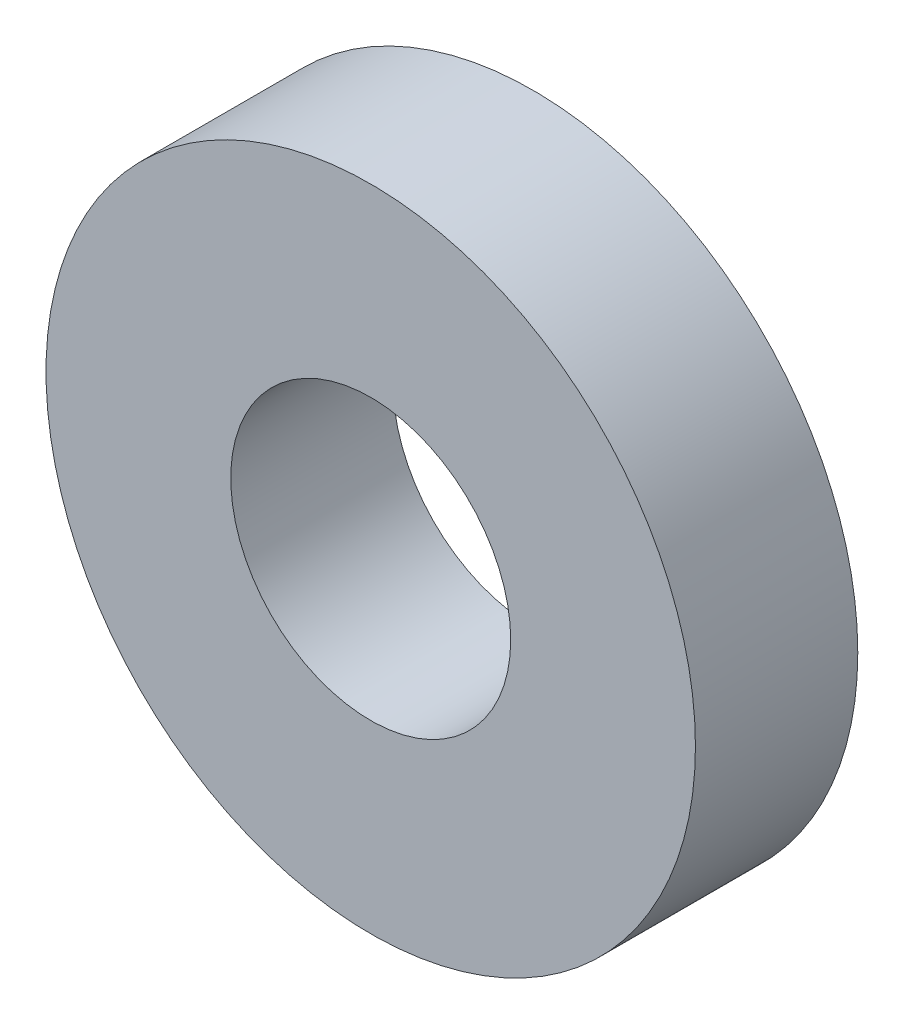
ISO-10303-21;
HEADER;
FILE_DESCRIPTION(('STEP AP214'),'2;1');
FILE_NAME('part.step','',(''),(''),'','','');
FILE_SCHEMA(('AUTOMOTIVE_DESIGN { 1 0 10303 214 1 1 1 1 }'));
ENDSEC;
DATA;
#1=APPLICATION_CONTEXT('core data for automotive mechanical design processes');
#2=APPLICATION_PROTOCOL_DEFINITION('international standard','automotive_design',2000,#1);
#3=PRODUCT_CONTEXT('',#1,'mechanical');
#4=PRODUCT('Part','Part','',(#3));
#5=PRODUCT_RELATED_PRODUCT_CATEGORY('part','',(#4));
#6=PRODUCT_DEFINITION_FORMATION('','',#4);
#7=PRODUCT_DEFINITION_CONTEXT('part definition',#1,'design');
#8=PRODUCT_DEFINITION('design','',#6,#7);
#9=PRODUCT_DEFINITION_SHAPE('','',#8);
#10=(LENGTH_UNIT() NAMED_UNIT(*) SI_UNIT(.MILLI.,.METRE.));
#11=(NAMED_UNIT(*) PLANE_ANGLE_UNIT() SI_UNIT($,.RADIAN.));
#12=(NAMED_UNIT(*) SI_UNIT($,.STERADIAN.) SOLID_ANGLE_UNIT());
#13=UNCERTAINTY_MEASURE_WITH_UNIT(LENGTH_MEASURE(1.E-05),#10,'distance_accuracy_value','');
#14=(GEOMETRIC_REPRESENTATION_CONTEXT(3) GLOBAL_UNCERTAINTY_ASSIGNED_CONTEXT((#13)) GLOBAL_UNIT_ASSIGNED_CONTEXT((#10,
#11,#12)) REPRESENTATION_CONTEXT('',''));
#15=CARTESIAN_POINT('',(0.,0.,0.));
#16=DIRECTION('',(0.,0.,1.));
#17=DIRECTION('',(1.,0.,0.));
#18=AXIS2_PLACEMENT_3D('',#15,#16,#17);
#19=CARTESIAN_POINT('',(0.,0.,3.175));
#20=DIRECTION('',(0.,0.,1.));
#21=DIRECTION('',(1.,0.,0.));
#22=AXIS2_PLACEMENT_3D('',#19,#20,#21);
#23=PLANE('',#22);
#24=CARTESIAN_POINT('',(0.,0.,3.175));
#25=DIRECTION('',(0.,0.,1.));
#26=DIRECTION('',(1.,0.,0.));
#27=AXIS2_PLACEMENT_3D('',#24,#25,#26);
#28=CIRCLE('',#27,6.35);
#29=CARTESIAN_POINT('',(6.35,0.,3.175));
#30=VERTEX_POINT('',#29);
#31=EDGE_CURVE('E10',#30,#30,#28,.T.);
#32=ORIENTED_EDGE('',*,*,#31,.T.);
#33=EDGE_LOOP('',(#32));
#34=FACE_BOUND('',#33,.T.);
#35=CARTESIAN_POINT('',(0.,0.,3.175));
#36=DIRECTION('',(0.,0.,1.));
#37=DIRECTION('',(1.,0.,0.));
#38=AXIS2_PLACEMENT_3D('',#35,#36,#37);
#39=CIRCLE('',#38,2.737499986);
#40=CARTESIAN_POINT('',(2.737499986,0.,3.175));
#41=VERTEX_POINT('',#40);
#42=EDGE_CURVE('E44',#41,#41,#39,.T.);
#43=ORIENTED_EDGE('',*,*,#42,.F.);
#44=EDGE_LOOP('',(#43));
#45=FACE_BOUND('',#44,.T.);
#46=ADVANCED_FACE('F33',(#34,#45),#23,.T.);
#47=CARTESIAN_POINT('',(0.,0.,0.));
#48=DIRECTION('',(0.,0.,1.));
#49=DIRECTION('',(1.,0.,0.));
#50=AXIS2_PLACEMENT_3D('',#47,#48,#49);
#51=PLANE('',#50);
#52=CARTESIAN_POINT('',(0.,0.,0.));
#53=DIRECTION('',(0.,0.,1.));
#54=DIRECTION('',(1.,0.,0.));
#55=AXIS2_PLACEMENT_3D('',#52,#53,#54);
#56=CIRCLE('',#55,6.35);
#57=CARTESIAN_POINT('',(6.35,0.,0.));
#58=VERTEX_POINT('',#57);
#59=EDGE_CURVE('E37',#58,#58,#56,.T.);
#60=ORIENTED_EDGE('',*,*,#59,.F.);
#61=EDGE_LOOP('',(#60));
#62=FACE_BOUND('',#61,.T.);
#63=CARTESIAN_POINT('',(0.,0.,0.));
#64=DIRECTION('',(0.,0.,1.));
#65=DIRECTION('',(1.,0.,0.));
#66=AXIS2_PLACEMENT_3D('',#63,#64,#65);
#67=CIRCLE('',#66,2.737499986);
#68=CARTESIAN_POINT('',(2.737499986,0.,0.));
#69=VERTEX_POINT('',#68);
#70=EDGE_CURVE('E46',#69,#69,#67,.T.);
#71=ORIENTED_EDGE('',*,*,#70,.T.);
#72=EDGE_LOOP('',(#71));
#73=FACE_BOUND('',#72,.T.);
#74=ADVANCED_FACE('F56',(#62,#73),#51,.F.);
#75=CARTESIAN_POINT('',(0.,0.,3.175));
#76=DIRECTION('',(0.,0.,-1.));
#77=DIRECTION('',(-1.,0.,0.));
#78=AXIS2_PLACEMENT_3D('',#75,#76,#77);
#79=CYLINDRICAL_SURFACE('',#78,6.35);
#80=ORIENTED_EDGE('',*,*,#31,.F.);
#81=EDGE_LOOP('',(#80));
#82=FACE_BOUND('',#81,.T.);
#83=ORIENTED_EDGE('',*,*,#59,.T.);
#84=EDGE_LOOP('',(#83));
#85=FACE_BOUND('',#84,.T.);
#86=ADVANCED_FACE('F35',(#82,#85),#79,.T.);
#87=CARTESIAN_POINT('',(0.,0.,3.175));
#88=DIRECTION('',(0.,0.,-1.));
#89=DIRECTION('',(-1.,0.,0.));
#90=AXIS2_PLACEMENT_3D('',#87,#88,#89);
#91=CYLINDRICAL_SURFACE('',#90,2.737499986);
#92=ORIENTED_EDGE('',*,*,#42,.T.);
#93=EDGE_LOOP('',(#92));
#94=FACE_BOUND('',#93,.T.);
#95=ORIENTED_EDGE('',*,*,#70,.F.);
#96=EDGE_LOOP('',(#95));
#97=FACE_BOUND('',#96,.T.);
#98=ADVANCED_FACE('F52',(#94,#97),#91,.F.);
#99=CLOSED_SHELL('',(#46,#74,#86,#98));
#100=MANIFOLD_SOLID_BREP('B2',#99);
#101=ADVANCED_BREP_SHAPE_REPRESENTATION('',(#18,#100),#14);
#102=SHAPE_DEFINITION_REPRESENTATION(#9,#101);
ENDSEC;
END-ISO-10303-21;
